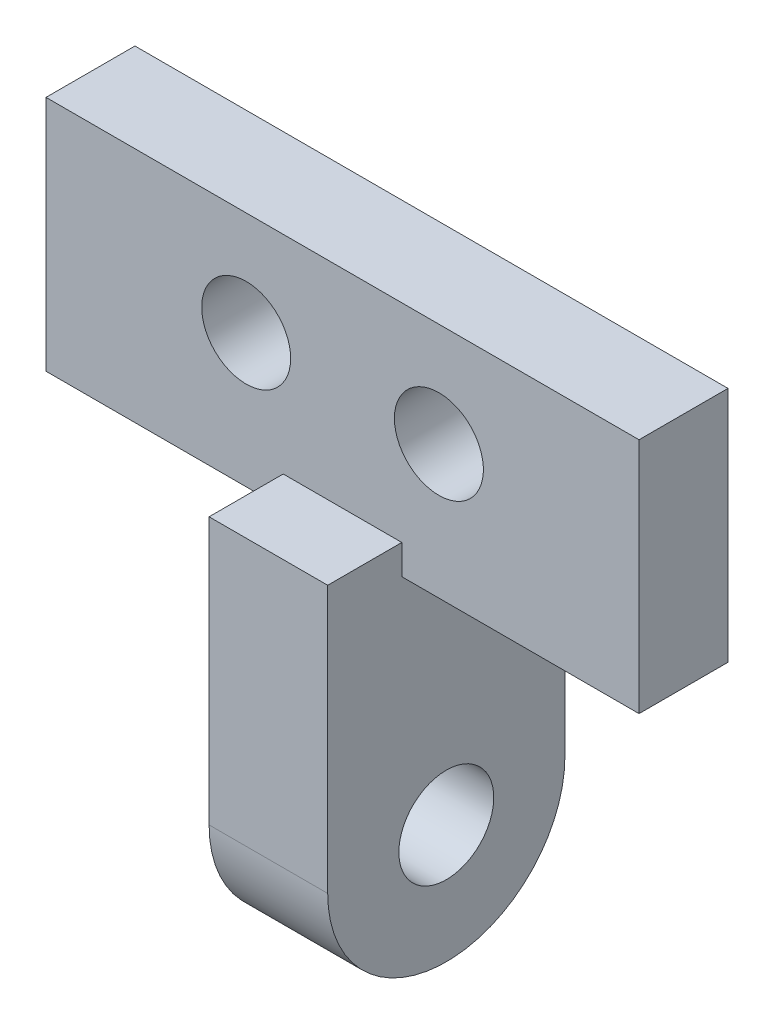
ISO-10303-21;
HEADER;
FILE_DESCRIPTION(('STEP AP214'),'2;1');
FILE_NAME('part.step','',(''),(''),'','','');
FILE_SCHEMA(('AUTOMOTIVE_DESIGN { 1 0 10303 214 1 1 1 1 }'));
ENDSEC;
DATA;
#1=APPLICATION_CONTEXT('core data for automotive mechanical design processes');
#2=APPLICATION_PROTOCOL_DEFINITION('international standard','automotive_design',2000,#1);
#3=PRODUCT_CONTEXT('',#1,'mechanical');
#4=PRODUCT('Part','Part','',(#3));
#5=PRODUCT_RELATED_PRODUCT_CATEGORY('part','',(#4));
#6=PRODUCT_DEFINITION_FORMATION('','',#4);
#7=PRODUCT_DEFINITION_CONTEXT('part definition',#1,'design');
#8=PRODUCT_DEFINITION('design','',#6,#7);
#9=PRODUCT_DEFINITION_SHAPE('','',#8);
#10=(LENGTH_UNIT() NAMED_UNIT(*) SI_UNIT(.MILLI.,.METRE.));
#11=(NAMED_UNIT(*) PLANE_ANGLE_UNIT() SI_UNIT($,.RADIAN.));
#12=(NAMED_UNIT(*) SI_UNIT($,.STERADIAN.) SOLID_ANGLE_UNIT());
#13=UNCERTAINTY_MEASURE_WITH_UNIT(LENGTH_MEASURE(1.E-05),#10,'distance_accuracy_value','');
#14=(GEOMETRIC_REPRESENTATION_CONTEXT(3) GLOBAL_UNCERTAINTY_ASSIGNED_CONTEXT((#13)) GLOBAL_UNIT_ASSIGNED_CONTEXT((#10,
#11,#12)) REPRESENTATION_CONTEXT('',''));
#15=CARTESIAN_POINT('',(0.,0.,0.));
#16=DIRECTION('',(0.,0.,1.));
#17=DIRECTION('',(1.,0.,0.));
#18=AXIS2_PLACEMENT_3D('',#15,#16,#17);
#19=CARTESIAN_POINT('',(-10.,0.,3.));
#20=DIRECTION('',(0.,1.,0.));
#21=DIRECTION('',(-1.,0.,0.));
#22=AXIS2_PLACEMENT_3D('',#19,#20,#21);
#23=PLANE('',#22);
#24=DIRECTION('',(0.,0.,1.));
#25=VECTOR('',#24,1.);
#26=CARTESIAN_POINT('',(-2.,0.,3.));
#27=LINE('',#26,#25);
#28=CARTESIAN_POINT('',(-2.,0.,0.));
#29=VERTEX_POINT('',#28);
#30=CARTESIAN_POINT('',(-2.,0.,3.));
#31=VERTEX_POINT('',#30);
#32=EDGE_CURVE('E198',#29,#31,#27,.T.);
#33=ORIENTED_EDGE('',*,*,#32,.T.);
#34=DIRECTION('',(1.,0.,0.));
#35=VECTOR('',#34,1.);
#36=CARTESIAN_POINT('',(-10.,0.,3.));
#37=LINE('',#36,#35);
#38=CARTESIAN_POINT('',(-10.,0.,3.));
#39=VERTEX_POINT('',#38);
#40=EDGE_CURVE('E241',#39,#31,#37,.T.);
#41=ORIENTED_EDGE('',*,*,#40,.F.);
#42=DIRECTION('',(0.,0.,-1.));
#43=VECTOR('',#42,1.);
#44=CARTESIAN_POINT('',(-10.,0.,3.));
#45=LINE('',#44,#43);
#46=CARTESIAN_POINT('',(-10.,0.,0.));
#47=VERTEX_POINT('',#46);
#48=EDGE_CURVE('E11',#39,#47,#45,.T.);
#49=ORIENTED_EDGE('',*,*,#48,.T.);
#50=DIRECTION('',(1.,0.,0.));
#51=VECTOR('',#50,1.);
#52=CARTESIAN_POINT('',(-10.,0.,0.));
#53=LINE('',#52,#51);
#54=EDGE_CURVE('E255',#47,#29,#53,.T.);
#55=ORIENTED_EDGE('',*,*,#54,.T.);
#56=EDGE_LOOP('',(#33,#41,#49,#55));
#57=FACE_BOUND('',#56,.T.);
#58=ADVANCED_FACE('F39',(#57),#23,.F.);
#59=CARTESIAN_POINT('',(0.,0.,3.));
#60=DIRECTION('',(0.,0.,1.));
#61=DIRECTION('',(1.,0.,0.));
#62=AXIS2_PLACEMENT_3D('',#59,#60,#61);
#63=PLANE('',#62);
#64=DIRECTION('',(0.,1.,0.));
#65=VECTOR('',#64,1.);
#66=CARTESIAN_POINT('',(2.,1.,3.));
#67=LINE('',#66,#65);
#68=CARTESIAN_POINT('',(2.,0.,3.));
#69=VERTEX_POINT('',#68);
#70=CARTESIAN_POINT('',(2.,1.,3.));
#71=VERTEX_POINT('',#70);
#72=EDGE_CURVE('E175',#69,#71,#67,.T.);
#73=ORIENTED_EDGE('',*,*,#72,.F.);
#74=CARTESIAN_POINT('',(10.,0.,3.));
#75=VERTEX_POINT('',#74);
#76=EDGE_CURVE('E239',#69,#75,#37,.T.);
#77=ORIENTED_EDGE('',*,*,#76,.T.);
#78=DIRECTION('',(0.,1.,0.));
#79=VECTOR('',#78,1.);
#80=CARTESIAN_POINT('',(10.,8.,3.));
#81=LINE('',#80,#79);
#82=CARTESIAN_POINT('',(10.,8.,3.));
#83=VERTEX_POINT('',#82);
#84=EDGE_CURVE('E244',#75,#83,#81,.T.);
#85=ORIENTED_EDGE('',*,*,#84,.T.);
#86=DIRECTION('',(-1.,0.,0.));
#87=VECTOR('',#86,1.);
#88=CARTESIAN_POINT('',(-10.,8.,3.));
#89=LINE('',#88,#87);
#90=CARTESIAN_POINT('',(-10.,8.,3.));
#91=VERTEX_POINT('',#90);
#92=EDGE_CURVE('E247',#83,#91,#89,.T.);
#93=ORIENTED_EDGE('',*,*,#92,.T.);
#94=DIRECTION('',(0.,-1.,0.));
#95=VECTOR('',#94,1.);
#96=CARTESIAN_POINT('',(-10.,8.,3.));
#97=LINE('',#96,#95);
#98=EDGE_CURVE('E235',#91,#39,#97,.T.);
#99=ORIENTED_EDGE('',*,*,#98,.T.);
#100=ORIENTED_EDGE('',*,*,#40,.T.);
#101=DIRECTION('',(0.,1.,0.));
#102=VECTOR('',#101,1.);
#103=CARTESIAN_POINT('',(-2.,1.,3.));
#104=LINE('',#103,#102);
#105=CARTESIAN_POINT('',(-2.,1.,3.));
#106=VERTEX_POINT('',#105);
#107=EDGE_CURVE('E60',#31,#106,#104,.T.);
#108=ORIENTED_EDGE('',*,*,#107,.T.);
#109=DIRECTION('',(-1.,0.,0.));
#110=VECTOR('',#109,1.);
#111=CARTESIAN_POINT('',(2.,1.,3.));
#112=LINE('',#111,#110);
#113=EDGE_CURVE('E55',#71,#106,#112,.T.);
#114=ORIENTED_EDGE('',*,*,#113,.F.);
#115=EDGE_LOOP('',(#73,#77,#85,#93,#99,#100,#108,#114));
#116=FACE_BOUND('',#115,.T.);
#117=CARTESIAN_POINT('',(-3.25,4.5,3.));
#118=DIRECTION('',(0.,0.,1.));
#119=DIRECTION('',(1.,0.,0.));
#120=AXIS2_PLACEMENT_3D('',#117,#118,#119);
#121=CIRCLE('',#120,1.5);
#122=CARTESIAN_POINT('',(-1.75,4.5,3.));
#123=VERTEX_POINT('',#122);
#124=EDGE_CURVE('E227',#123,#123,#121,.T.);
#125=ORIENTED_EDGE('',*,*,#124,.F.);
#126=EDGE_LOOP('',(#125));
#127=FACE_BOUND('',#126,.T.);
#128=CARTESIAN_POINT('',(3.25,4.5,3.));
#129=DIRECTION('',(0.,0.,1.));
#130=DIRECTION('',(-1.,0.,0.));
#131=AXIS2_PLACEMENT_3D('',#128,#129,#130);
#132=CIRCLE('',#131,1.5);
#133=CARTESIAN_POINT('',(1.75,4.5,3.));
#134=VERTEX_POINT('',#133);
#135=EDGE_CURVE('E219',#134,#134,#132,.T.);
#136=ORIENTED_EDGE('',*,*,#135,.F.);
#137=EDGE_LOOP('',(#136));
#138=FACE_BOUND('',#137,.T.);
#139=ADVANCED_FACE('F292',(#116,#127,#138),#63,.T.);
#140=CARTESIAN_POINT('',(0.,0.,0.));
#141=DIRECTION('',(0.,0.,1.));
#142=DIRECTION('',(1.,0.,0.));
#143=AXIS2_PLACEMENT_3D('',#140,#141,#142);
#144=PLANE('',#143);
#145=CARTESIAN_POINT('',(2.,0.,0.));
#146=VERTEX_POINT('',#145);
#147=CARTESIAN_POINT('',(10.,0.,0.));
#148=VERTEX_POINT('',#147);
#149=EDGE_CURVE('E254',#146,#148,#53,.T.);
#150=ORIENTED_EDGE('',*,*,#149,.F.);
#151=DIRECTION('',(0.,-1.,0.));
#152=VECTOR('',#151,1.);
#153=CARTESIAN_POINT('',(2.,1.,0.));
#154=LINE('',#153,#152);
#155=CARTESIAN_POINT('',(2.,1.,0.));
#156=VERTEX_POINT('',#155);
#157=EDGE_CURVE('E167',#156,#146,#154,.T.);
#158=ORIENTED_EDGE('',*,*,#157,.F.);
#159=DIRECTION('',(-1.,0.,0.));
#160=VECTOR('',#159,1.);
#161=CARTESIAN_POINT('',(2.,1.,0.));
#162=LINE('',#161,#160);
#163=CARTESIAN_POINT('',(-2.,1.,0.));
#164=VERTEX_POINT('',#163);
#165=EDGE_CURVE('E210',#156,#164,#162,.T.);
#166=ORIENTED_EDGE('',*,*,#165,.T.);
#167=DIRECTION('',(0.,-1.,0.));
#168=VECTOR('',#167,1.);
#169=CARTESIAN_POINT('',(-2.,1.,0.));
#170=LINE('',#169,#168);
#171=EDGE_CURVE('E194',#164,#29,#170,.T.);
#172=ORIENTED_EDGE('',*,*,#171,.T.);
#173=ORIENTED_EDGE('',*,*,#54,.F.);
#174=DIRECTION('',(0.,-1.,0.));
#175=VECTOR('',#174,1.);
#176=CARTESIAN_POINT('',(-10.,8.,0.));
#177=LINE('',#176,#175);
#178=CARTESIAN_POINT('',(-10.,8.,0.));
#179=VERTEX_POINT('',#178);
#180=EDGE_CURVE('E231',#179,#47,#177,.T.);
#181=ORIENTED_EDGE('',*,*,#180,.F.);
#182=DIRECTION('',(-1.,0.,0.));
#183=VECTOR('',#182,1.);
#184=CARTESIAN_POINT('',(-10.,8.,0.));
#185=LINE('',#184,#183);
#186=CARTESIAN_POINT('',(10.,8.,0.));
#187=VERTEX_POINT('',#186);
#188=EDGE_CURVE('E240',#187,#179,#185,.T.);
#189=ORIENTED_EDGE('',*,*,#188,.F.);
#190=DIRECTION('',(0.,1.,0.));
#191=VECTOR('',#190,1.);
#192=CARTESIAN_POINT('',(10.,8.,0.));
#193=LINE('',#192,#191);
#194=EDGE_CURVE('E258',#148,#187,#193,.T.);
#195=ORIENTED_EDGE('',*,*,#194,.F.);
#196=EDGE_LOOP('',(#150,#158,#166,#172,#173,#181,#189,#195));
#197=FACE_BOUND('',#196,.T.);
#198=CARTESIAN_POINT('',(-3.25,4.5,0.));
#199=DIRECTION('',(0.,0.,1.));
#200=DIRECTION('',(1.,0.,0.));
#201=AXIS2_PLACEMENT_3D('',#198,#199,#200);
#202=CIRCLE('',#201,1.5);
#203=CARTESIAN_POINT('',(-1.75,4.5,0.));
#204=VERTEX_POINT('',#203);
#205=EDGE_CURVE('E223',#204,#204,#202,.T.);
#206=ORIENTED_EDGE('',*,*,#205,.T.);
#207=EDGE_LOOP('',(#206));
#208=FACE_BOUND('',#207,.T.);
#209=CARTESIAN_POINT('',(3.25,4.5,0.));
#210=DIRECTION('',(0.,0.,1.));
#211=DIRECTION('',(-1.,0.,0.));
#212=AXIS2_PLACEMENT_3D('',#209,#210,#211);
#213=CIRCLE('',#212,1.5);
#214=CARTESIAN_POINT('',(1.75,4.5,0.));
#215=VERTEX_POINT('',#214);
#216=EDGE_CURVE('E150',#215,#215,#213,.T.);
#217=ORIENTED_EDGE('',*,*,#216,.T.);
#218=EDGE_LOOP('',(#217));
#219=FACE_BOUND('',#218,.T.);
#220=ADVANCED_FACE('F282',(#197,#208,#219),#144,.F.);
#221=CARTESIAN_POINT('',(-10.,8.,3.));
#222=DIRECTION('',(1.,0.,0.));
#223=DIRECTION('',(0.,1.,0.));
#224=AXIS2_PLACEMENT_3D('',#221,#222,#223);
#225=PLANE('',#224);
#226=ORIENTED_EDGE('',*,*,#180,.T.);
#227=ORIENTED_EDGE('',*,*,#48,.F.);
#228=ORIENTED_EDGE('',*,*,#98,.F.);
#229=DIRECTION('',(0.,0.,-1.));
#230=VECTOR('',#229,1.);
#231=CARTESIAN_POINT('',(-10.,8.,3.));
#232=LINE('',#231,#230);
#233=EDGE_CURVE('E250',#91,#179,#232,.T.);
#234=ORIENTED_EDGE('',*,*,#233,.T.);
#235=EDGE_LOOP('',(#226,#227,#228,#234));
#236=FACE_BOUND('',#235,.T.);
#237=ADVANCED_FACE('F41',(#236),#225,.F.);
#238=ORIENTED_EDGE('',*,*,#76,.F.);
#239=DIRECTION('',(0.,0.,1.));
#240=VECTOR('',#239,1.);
#241=CARTESIAN_POINT('',(2.,0.,3.));
#242=LINE('',#241,#240);
#243=EDGE_CURVE('E171',#146,#69,#242,.T.);
#244=ORIENTED_EDGE('',*,*,#243,.F.);
#245=ORIENTED_EDGE('',*,*,#149,.T.);
#246=DIRECTION('',(0.,0.,-1.));
#247=VECTOR('',#246,1.);
#248=CARTESIAN_POINT('',(10.,0.,3.));
#249=LINE('',#248,#247);
#250=EDGE_CURVE('E48',#75,#148,#249,.T.);
#251=ORIENTED_EDGE('',*,*,#250,.F.);
#252=EDGE_LOOP('',(#238,#244,#245,#251));
#253=FACE_BOUND('',#252,.T.);
#254=ADVANCED_FACE('F296',(#253),#23,.F.);
#255=CARTESIAN_POINT('',(10.,8.,3.));
#256=DIRECTION('',(-1.,0.,0.));
#257=DIRECTION('',(0.,-1.,0.));
#258=AXIS2_PLACEMENT_3D('',#255,#256,#257);
#259=PLANE('',#258);
#260=ORIENTED_EDGE('',*,*,#194,.T.);
#261=DIRECTION('',(0.,0.,-1.));
#262=VECTOR('',#261,1.);
#263=CARTESIAN_POINT('',(10.,8.,3.));
#264=LINE('',#263,#262);
#265=EDGE_CURVE('E266',#83,#187,#264,.T.);
#266=ORIENTED_EDGE('',*,*,#265,.F.);
#267=ORIENTED_EDGE('',*,*,#84,.F.);
#268=ORIENTED_EDGE('',*,*,#250,.T.);
#269=EDGE_LOOP('',(#260,#266,#267,#268));
#270=FACE_BOUND('',#269,.T.);
#271=ADVANCED_FACE('F275',(#270),#259,.F.);
#272=CARTESIAN_POINT('',(-10.,8.,3.));
#273=DIRECTION('',(0.,-1.,0.));
#274=DIRECTION('',(0.,0.,-1.));
#275=AXIS2_PLACEMENT_3D('',#272,#273,#274);
#276=PLANE('',#275);
#277=ORIENTED_EDGE('',*,*,#188,.T.);
#278=ORIENTED_EDGE('',*,*,#233,.F.);
#279=ORIENTED_EDGE('',*,*,#92,.F.);
#280=ORIENTED_EDGE('',*,*,#265,.T.);
#281=EDGE_LOOP('',(#277,#278,#279,#280));
#282=FACE_BOUND('',#281,.T.);
#283=ADVANCED_FACE('F287',(#282),#276,.F.);
#284=CARTESIAN_POINT('',(-3.25,4.5,3.));
#285=DIRECTION('',(0.,0.,-1.));
#286=DIRECTION('',(-1.,0.,0.));
#287=AXIS2_PLACEMENT_3D('',#284,#285,#286);
#288=CYLINDRICAL_SURFACE('',#287,1.5);
#289=ORIENTED_EDGE('',*,*,#124,.T.);
#290=EDGE_LOOP('',(#289));
#291=FACE_BOUND('',#290,.T.);
#292=ORIENTED_EDGE('',*,*,#205,.F.);
#293=EDGE_LOOP('',(#292));
#294=FACE_BOUND('',#293,.T.);
#295=ADVANCED_FACE('F330',(#291,#294),#288,.F.);
#296=CARTESIAN_POINT('',(3.25,4.5,3.));
#297=DIRECTION('',(0.,0.,-1.));
#298=DIRECTION('',(-1.,0.,0.));
#299=AXIS2_PLACEMENT_3D('',#296,#297,#298);
#300=CYLINDRICAL_SURFACE('',#299,1.5);
#301=ORIENTED_EDGE('',*,*,#135,.T.);
#302=EDGE_LOOP('',(#301));
#303=FACE_BOUND('',#302,.T.);
#304=ORIENTED_EDGE('',*,*,#216,.F.);
#305=EDGE_LOOP('',(#304));
#306=FACE_BOUND('',#305,.T.);
#307=ADVANCED_FACE('F334',(#303,#306),#300,.F.);
#308=CARTESIAN_POINT('',(2.,-8.,1.5));
#309=DIRECTION('',(1.,0.,0.));
#310=DIRECTION('',(0.,1.,0.));
#311=AXIS2_PLACEMENT_3D('',#308,#309,#310);
#312=PLANE('',#311);
#313=DIRECTION('',(0.,-1.,0.));
#314=VECTOR('',#313,1.);
#315=CARTESIAN_POINT('',(2.,1.,5.5));
#316=LINE('',#315,#314);
#317=CARTESIAN_POINT('',(2.,1.,5.5));
#318=VERTEX_POINT('',#317);
#319=CARTESIAN_POINT('',(2.,-8.,5.5));
#320=VERTEX_POINT('',#319);
#321=EDGE_CURVE('E127',#318,#320,#316,.T.);
#322=ORIENTED_EDGE('',*,*,#321,.T.);
#323=CARTESIAN_POINT('',(2.,-8.,1.5));
#324=DIRECTION('',(1.,0.,0.));
#325=DIRECTION('',(0.,1.,0.));
#326=AXIS2_PLACEMENT_3D('',#323,#324,#325);
#327=CIRCLE('',#326,4.);
#328=CARTESIAN_POINT('',(2.,-8.,-2.5));
#329=VERTEX_POINT('',#328);
#330=EDGE_CURVE('E132',#320,#329,#327,.T.);
#331=ORIENTED_EDGE('',*,*,#330,.T.);
#332=DIRECTION('',(0.,1.,0.));
#333=VECTOR('',#332,1.);
#334=CARTESIAN_POINT('',(2.,0.,-2.5));
#335=LINE('',#334,#333);
#336=CARTESIAN_POINT('',(2.,1.,-2.5));
#337=VERTEX_POINT('',#336);
#338=EDGE_CURVE('E157',#329,#337,#335,.T.);
#339=ORIENTED_EDGE('',*,*,#338,.T.);
#340=DIRECTION('',(0.,0.,1.));
#341=VECTOR('',#340,1.);
#342=CARTESIAN_POINT('',(2.,1.,0.));
#343=LINE('',#342,#341);
#344=EDGE_CURVE('E160',#337,#156,#343,.T.);
#345=ORIENTED_EDGE('',*,*,#344,.T.);
#346=ORIENTED_EDGE('',*,*,#157,.T.);
#347=ORIENTED_EDGE('',*,*,#243,.T.);
#348=ORIENTED_EDGE('',*,*,#72,.T.);
#349=DIRECTION('',(0.,0.,1.));
#350=VECTOR('',#349,1.);
#351=CARTESIAN_POINT('',(2.,1.,3.));
#352=LINE('',#351,#350);
#353=EDGE_CURVE('E135',#71,#318,#352,.T.);
#354=ORIENTED_EDGE('',*,*,#353,.T.);
#355=EDGE_LOOP('',(#322,#331,#339,#345,#346,#347,#348,#354));
#356=FACE_BOUND('',#355,.T.);
#357=CARTESIAN_POINT('',(2.,-8.,1.5));
#358=DIRECTION('',(1.,0.,0.));
#359=DIRECTION('',(0.,1.,0.));
#360=AXIS2_PLACEMENT_3D('',#357,#358,#359);
#361=CIRCLE('',#360,1.6);
#362=CARTESIAN_POINT('',(2.,-6.4,1.5));
#363=VERTEX_POINT('',#362);
#364=EDGE_CURVE('E184',#363,#363,#361,.T.);
#365=ORIENTED_EDGE('',*,*,#364,.F.);
#366=EDGE_LOOP('',(#365));
#367=FACE_BOUND('',#366,.T.);
#368=ADVANCED_FACE('F129',(#356,#367),#312,.T.);
#369=CARTESIAN_POINT('',(-2.,-8.,1.5));
#370=DIRECTION('',(1.,0.,0.));
#371=DIRECTION('',(0.,1.,0.));
#372=AXIS2_PLACEMENT_3D('',#369,#370,#371);
#373=PLANE('',#372);
#374=DIRECTION('',(0.,-1.,0.));
#375=VECTOR('',#374,1.);
#376=CARTESIAN_POINT('',(-2.,0.,5.5));
#377=LINE('',#376,#375);
#378=CARTESIAN_POINT('',(-2.,1.,5.5));
#379=VERTEX_POINT('',#378);
#380=CARTESIAN_POINT('',(-2.,-8.,5.5));
#381=VERTEX_POINT('',#380);
#382=EDGE_CURVE('E145',#379,#381,#377,.T.);
#383=ORIENTED_EDGE('',*,*,#382,.F.);
#384=DIRECTION('',(0.,0.,1.));
#385=VECTOR('',#384,1.);
#386=CARTESIAN_POINT('',(-2.,1.,3.));
#387=LINE('',#386,#385);
#388=EDGE_CURVE('E140',#106,#379,#387,.T.);
#389=ORIENTED_EDGE('',*,*,#388,.F.);
#390=ORIENTED_EDGE('',*,*,#107,.F.);
#391=ORIENTED_EDGE('',*,*,#32,.F.);
#392=ORIENTED_EDGE('',*,*,#171,.F.);
#393=DIRECTION('',(0.,0.,1.));
#394=VECTOR('',#393,1.);
#395=CARTESIAN_POINT('',(-2.,1.,0.));
#396=LINE('',#395,#394);
#397=CARTESIAN_POINT('',(-2.,1.,-2.5));
#398=VERTEX_POINT('',#397);
#399=EDGE_CURVE('E190',#398,#164,#396,.T.);
#400=ORIENTED_EDGE('',*,*,#399,.F.);
#401=DIRECTION('',(0.,1.,0.));
#402=VECTOR('',#401,1.);
#403=CARTESIAN_POINT('',(-2.,1.,-2.5));
#404=LINE('',#403,#402);
#405=CARTESIAN_POINT('',(-2.,-8.,-2.5));
#406=VERTEX_POINT('',#405);
#407=EDGE_CURVE('E187',#406,#398,#404,.T.);
#408=ORIENTED_EDGE('',*,*,#407,.F.);
#409=CARTESIAN_POINT('',(-2.,-8.,1.5));
#410=DIRECTION('',(1.,0.,0.));
#411=DIRECTION('',(0.,1.,0.));
#412=AXIS2_PLACEMENT_3D('',#409,#410,#411);
#413=CIRCLE('',#412,4.);
#414=EDGE_CURVE('E183',#381,#406,#413,.T.);
#415=ORIENTED_EDGE('',*,*,#414,.F.);
#416=EDGE_LOOP('',(#383,#389,#390,#391,#392,#400,#408,#415));
#417=FACE_BOUND('',#416,.T.);
#418=CARTESIAN_POINT('',(-2.,-8.,1.5));
#419=DIRECTION('',(1.,0.,0.));
#420=DIRECTION('',(0.,1.,0.));
#421=AXIS2_PLACEMENT_3D('',#418,#419,#420);
#422=CIRCLE('',#421,1.6);
#423=CARTESIAN_POINT('',(-2.,-6.4,1.5));
#424=VERTEX_POINT('',#423);
#425=EDGE_CURVE('E371',#424,#424,#422,.T.);
#426=ORIENTED_EDGE('',*,*,#425,.T.);
#427=EDGE_LOOP('',(#426));
#428=FACE_BOUND('',#427,.T.);
#429=ADVANCED_FACE('F306',(#417,#428),#373,.F.);
#430=CARTESIAN_POINT('',(2.,0.,5.5));
#431=DIRECTION('',(0.,0.,-1.));
#432=DIRECTION('',(0.,1.,0.));
#433=AXIS2_PLACEMENT_3D('',#430,#431,#432);
#434=PLANE('',#433);
#435=ORIENTED_EDGE('',*,*,#382,.T.);
#436=DIRECTION('',(-1.,0.,0.));
#437=VECTOR('',#436,1.);
#438=CARTESIAN_POINT('',(2.,-8.,5.5));
#439=LINE('',#438,#437);
#440=EDGE_CURVE('E143',#320,#381,#439,.T.);
#441=ORIENTED_EDGE('',*,*,#440,.F.);
#442=ORIENTED_EDGE('',*,*,#321,.F.);
#443=DIRECTION('',(-1.,0.,0.));
#444=VECTOR('',#443,1.);
#445=CARTESIAN_POINT('',(2.,1.,5.5));
#446=LINE('',#445,#444);
#447=EDGE_CURVE('E180',#318,#379,#446,.T.);
#448=ORIENTED_EDGE('',*,*,#447,.T.);
#449=EDGE_LOOP('',(#435,#441,#442,#448));
#450=FACE_BOUND('',#449,.T.);
#451=ADVANCED_FACE('F144',(#450),#434,.F.);
#452=CARTESIAN_POINT('',(2.,-8.,1.5));
#453=DIRECTION('',(-1.,0.,0.));
#454=DIRECTION('',(0.,-1.,0.));
#455=AXIS2_PLACEMENT_3D('',#452,#453,#454);
#456=CYLINDRICAL_SURFACE('',#455,4.);
#457=ORIENTED_EDGE('',*,*,#414,.T.);
#458=DIRECTION('',(-1.,0.,0.));
#459=VECTOR('',#458,1.);
#460=CARTESIAN_POINT('',(2.,-8.,-2.5));
#461=LINE('',#460,#459);
#462=EDGE_CURVE('E151',#329,#406,#461,.T.);
#463=ORIENTED_EDGE('',*,*,#462,.F.);
#464=ORIENTED_EDGE('',*,*,#330,.F.);
#465=ORIENTED_EDGE('',*,*,#440,.T.);
#466=EDGE_LOOP('',(#457,#463,#464,#465));
#467=FACE_BOUND('',#466,.T.);
#468=ADVANCED_FACE('F153',(#467),#456,.T.);
#469=CARTESIAN_POINT('',(2.,1.,-2.5));
#470=DIRECTION('',(0.,0.,1.));
#471=DIRECTION('',(1.,0.,0.));
#472=AXIS2_PLACEMENT_3D('',#469,#470,#471);
#473=PLANE('',#472);
#474=ORIENTED_EDGE('',*,*,#407,.T.);
#475=DIRECTION('',(-1.,0.,0.));
#476=VECTOR('',#475,1.);
#477=CARTESIAN_POINT('',(2.,1.,-2.5));
#478=LINE('',#477,#476);
#479=EDGE_CURVE('E213',#337,#398,#478,.T.);
#480=ORIENTED_EDGE('',*,*,#479,.F.);
#481=ORIENTED_EDGE('',*,*,#338,.F.);
#482=ORIENTED_EDGE('',*,*,#462,.T.);
#483=EDGE_LOOP('',(#474,#480,#481,#482));
#484=FACE_BOUND('',#483,.T.);
#485=ADVANCED_FACE('F347',(#484),#473,.F.);
#486=CARTESIAN_POINT('',(2.,1.,0.));
#487=DIRECTION('',(0.,-1.,0.));
#488=DIRECTION('',(1.,0.,0.));
#489=AXIS2_PLACEMENT_3D('',#486,#487,#488);
#490=PLANE('',#489);
#491=ORIENTED_EDGE('',*,*,#399,.T.);
#492=ORIENTED_EDGE('',*,*,#165,.F.);
#493=ORIENTED_EDGE('',*,*,#344,.F.);
#494=ORIENTED_EDGE('',*,*,#479,.T.);
#495=EDGE_LOOP('',(#491,#492,#493,#494));
#496=FACE_BOUND('',#495,.T.);
#497=ADVANCED_FACE('F303',(#496),#490,.F.);
#498=CARTESIAN_POINT('',(2.,1.,3.));
#499=DIRECTION('',(0.,-1.,0.));
#500=DIRECTION('',(1.,0.,0.));
#501=AXIS2_PLACEMENT_3D('',#498,#499,#500);
#502=PLANE('',#501);
#503=ORIENTED_EDGE('',*,*,#388,.T.);
#504=ORIENTED_EDGE('',*,*,#447,.F.);
#505=ORIENTED_EDGE('',*,*,#353,.F.);
#506=ORIENTED_EDGE('',*,*,#113,.T.);
#507=EDGE_LOOP('',(#503,#504,#505,#506));
#508=FACE_BOUND('',#507,.T.);
#509=ADVANCED_FACE('F353',(#508),#502,.F.);
#510=CARTESIAN_POINT('',(2.,-8.,1.5));
#511=DIRECTION('',(-1.,0.,0.));
#512=DIRECTION('',(0.,-1.,0.));
#513=AXIS2_PLACEMENT_3D('',#510,#511,#512);
#514=CYLINDRICAL_SURFACE('',#513,1.6);
#515=ORIENTED_EDGE('',*,*,#364,.T.);
#516=EDGE_LOOP('',(#515));
#517=FACE_BOUND('',#516,.T.);
#518=ORIENTED_EDGE('',*,*,#425,.F.);
#519=EDGE_LOOP('',(#518));
#520=FACE_BOUND('',#519,.T.);
#521=ADVANCED_FACE('F356',(#517,#520),#514,.F.);
#522=CLOSED_SHELL('',(#58,#139,#220,#237,#254,#271,#283,#295,#307,#368,#429,#451,#468,#485,#497,
#509,#521));
#523=MANIFOLD_SOLID_BREP('B2',#522);
#524=ADVANCED_BREP_SHAPE_REPRESENTATION('',(#18,#523),#14);
#525=SHAPE_DEFINITION_REPRESENTATION(#9,#524);
ENDSEC;
END-ISO-10303-21;
